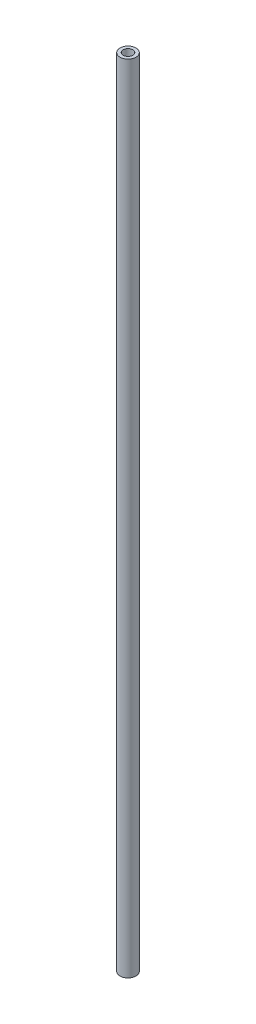
ISO-10303-21;
HEADER;
FILE_DESCRIPTION(('STEP AP214'),'2;1');
FILE_NAME('part.step','',(''),(''),'','','');
FILE_SCHEMA(('AUTOMOTIVE_DESIGN { 1 0 10303 214 1 1 1 1 }'));
ENDSEC;
DATA;
#1=APPLICATION_CONTEXT('core data for automotive mechanical design processes');
#2=APPLICATION_PROTOCOL_DEFINITION('international standard','automotive_design',2000,#1);
#3=PRODUCT_CONTEXT('',#1,'mechanical');
#4=PRODUCT('Part','Part','',(#3));
#5=PRODUCT_RELATED_PRODUCT_CATEGORY('part','',(#4));
#6=PRODUCT_DEFINITION_FORMATION('','',#4);
#7=PRODUCT_DEFINITION_CONTEXT('part definition',#1,'design');
#8=PRODUCT_DEFINITION('design','',#6,#7);
#9=PRODUCT_DEFINITION_SHAPE('','',#8);
#10=(LENGTH_UNIT() NAMED_UNIT(*) SI_UNIT(.MILLI.,.METRE.));
#11=(NAMED_UNIT(*) PLANE_ANGLE_UNIT() SI_UNIT($,.RADIAN.));
#12=(NAMED_UNIT(*) SI_UNIT($,.STERADIAN.) SOLID_ANGLE_UNIT());
#13=UNCERTAINTY_MEASURE_WITH_UNIT(LENGTH_MEASURE(1.E-05),#10,'distance_accuracy_value','');
#14=(GEOMETRIC_REPRESENTATION_CONTEXT(3) GLOBAL_UNCERTAINTY_ASSIGNED_CONTEXT((#13)) GLOBAL_UNIT_ASSIGNED_CONTEXT((#10,
#11,#12)) REPRESENTATION_CONTEXT('',''));
#15=CARTESIAN_POINT('',(0.,0.,0.));
#16=DIRECTION('',(0.,0.,1.));
#17=DIRECTION('',(1.,0.,0.));
#18=AXIS2_PLACEMENT_3D('',#15,#16,#17);
#19=CARTESIAN_POINT('',(0.,497.,0.));
#20=DIRECTION('',(0.,1.,0.));
#21=DIRECTION('',(0.,0.,1.));
#22=AXIS2_PLACEMENT_3D('',#19,#20,#21);
#23=PLANE('',#22);
#24=CARTESIAN_POINT('',(0.,497.,0.));
#25=DIRECTION('',(0.,1.,0.));
#26=DIRECTION('',(0.,0.,1.));
#27=AXIS2_PLACEMENT_3D('',#24,#25,#26);
#28=CIRCLE('',#27,5.);
#29=CARTESIAN_POINT('',(0.,497.,-5.));
#30=VERTEX_POINT('',#29);
#31=EDGE_CURVE('E10',#30,#30,#28,.T.);
#32=ORIENTED_EDGE('',*,*,#31,.T.);
#33=EDGE_LOOP('',(#32));
#34=FACE_BOUND('',#33,.T.);
#35=CARTESIAN_POINT('',(0.,497.,0.));
#36=DIRECTION('',(0.,1.,0.));
#37=DIRECTION('',(0.,0.,1.));
#38=AXIS2_PLACEMENT_3D('',#35,#36,#37);
#39=CIRCLE('',#38,3.);
#40=CARTESIAN_POINT('',(0.,497.,-3.));
#41=VERTEX_POINT('',#40);
#42=EDGE_CURVE('E50',#41,#41,#39,.T.);
#43=ORIENTED_EDGE('',*,*,#42,.F.);
#44=EDGE_LOOP('',(#43));
#45=FACE_BOUND('',#44,.T.);
#46=ADVANCED_FACE('F37',(#34,#45),#23,.T.);
#47=CARTESIAN_POINT('',(0.,0.,0.));
#48=DIRECTION('',(0.,1.,0.));
#49=DIRECTION('',(0.,0.,1.));
#50=AXIS2_PLACEMENT_3D('',#47,#48,#49);
#51=PLANE('',#50);
#52=CARTESIAN_POINT('',(0.,0.,0.));
#53=DIRECTION('',(0.,1.,0.));
#54=DIRECTION('',(0.,0.,1.));
#55=AXIS2_PLACEMENT_3D('',#52,#53,#54);
#56=CIRCLE('',#55,5.);
#57=CARTESIAN_POINT('',(0.,0.,-5.));
#58=VERTEX_POINT('',#57);
#59=EDGE_CURVE('E41',#58,#58,#56,.T.);
#60=ORIENTED_EDGE('',*,*,#59,.F.);
#61=EDGE_LOOP('',(#60));
#62=FACE_BOUND('',#61,.T.);
#63=CARTESIAN_POINT('',(0.,0.,0.));
#64=DIRECTION('',(0.,1.,0.));
#65=DIRECTION('',(0.,0.,1.));
#66=AXIS2_PLACEMENT_3D('',#63,#64,#65);
#67=CIRCLE('',#66,3.);
#68=CARTESIAN_POINT('',(0.,0.,-3.));
#69=VERTEX_POINT('',#68);
#70=EDGE_CURVE('E52',#69,#69,#67,.T.);
#71=ORIENTED_EDGE('',*,*,#70,.T.);
#72=EDGE_LOOP('',(#71));
#73=FACE_BOUND('',#72,.T.);
#74=ADVANCED_FACE('F64',(#62,#73),#51,.F.);
#75=CARTESIAN_POINT('',(0.,497.,0.));
#76=DIRECTION('',(0.,-1.,0.));
#77=DIRECTION('',(0.,0.,-1.));
#78=AXIS2_PLACEMENT_3D('',#75,#76,#77);
#79=CYLINDRICAL_SURFACE('',#78,5.);
#80=CARTESIAN_POINT('',(0.,497.,-5.));
#81=CARTESIAN_POINT('',(0.,491.822916666667,-5.));
#82=CARTESIAN_POINT('',(0.,486.645833333333,-5.));
#83=CARTESIAN_POINT('',(0.,476.291666666667,-5.));
#84=CARTESIAN_POINT('',(0.,471.114583333333,-5.));
#85=CARTESIAN_POINT('',(0.,460.760416666667,-5.));
#86=CARTESIAN_POINT('',(0.,455.583333333333,-5.));
#87=CARTESIAN_POINT('',(0.,445.229166666667,-5.));
#88=CARTESIAN_POINT('',(0.,440.052083333333,-5.));
#89=CARTESIAN_POINT('',(0.,429.697916666667,-5.));
#90=CARTESIAN_POINT('',(0.,424.520833333333,-5.));
#91=CARTESIAN_POINT('',(0.,414.166666666667,-5.));
#92=CARTESIAN_POINT('',(0.,408.989583333333,-5.));
#93=CARTESIAN_POINT('',(0.,398.635416666667,-5.));
#94=CARTESIAN_POINT('',(0.,393.458333333333,-5.));
#95=CARTESIAN_POINT('',(0.,383.104166666667,-5.));
#96=CARTESIAN_POINT('',(0.,377.927083333333,-5.));
#97=CARTESIAN_POINT('',(0.,367.572916666667,-5.));
#98=CARTESIAN_POINT('',(0.,362.395833333333,-5.));
#99=CARTESIAN_POINT('',(0.,352.041666666667,-5.));
#100=CARTESIAN_POINT('',(0.,346.864583333333,-5.));
#101=CARTESIAN_POINT('',(0.,336.510416666667,-5.));
#102=CARTESIAN_POINT('',(0.,331.333333333333,-5.));
#103=CARTESIAN_POINT('',(0.,320.979166666667,-5.));
#104=CARTESIAN_POINT('',(0.,315.802083333333,-5.));
#105=CARTESIAN_POINT('',(0.,305.447916666667,-5.));
#106=CARTESIAN_POINT('',(0.,300.270833333333,-5.));
#107=CARTESIAN_POINT('',(0.,289.916666666667,-5.));
#108=CARTESIAN_POINT('',(0.,284.739583333333,-5.));
#109=CARTESIAN_POINT('',(0.,274.385416666667,-5.));
#110=CARTESIAN_POINT('',(0.,269.208333333333,-5.));
#111=CARTESIAN_POINT('',(0.,258.854166666667,-5.));
#112=CARTESIAN_POINT('',(0.,253.677083333333,-5.));
#113=CARTESIAN_POINT('',(0.,243.322916666667,-5.));
#114=CARTESIAN_POINT('',(0.,238.145833333333,-5.));
#115=CARTESIAN_POINT('',(0.,227.791666666667,-5.));
#116=CARTESIAN_POINT('',(0.,222.614583333333,-5.));
#117=CARTESIAN_POINT('',(0.,212.260416666667,-5.));
#118=CARTESIAN_POINT('',(0.,207.083333333333,-5.));
#119=CARTESIAN_POINT('',(0.,196.729166666667,-5.));
#120=CARTESIAN_POINT('',(0.,191.552083333333,-5.));
#121=CARTESIAN_POINT('',(0.,181.197916666667,-5.));
#122=CARTESIAN_POINT('',(0.,176.020833333333,-5.));
#123=CARTESIAN_POINT('',(0.,165.666666666667,-5.));
#124=CARTESIAN_POINT('',(0.,160.489583333333,-5.));
#125=CARTESIAN_POINT('',(0.,150.135416666667,-5.));
#126=CARTESIAN_POINT('',(0.,144.958333333333,-5.));
#127=CARTESIAN_POINT('',(0.,134.604166666667,-5.));
#128=CARTESIAN_POINT('',(0.,129.427083333333,-5.));
#129=CARTESIAN_POINT('',(0.,119.072916666667,-5.));
#130=CARTESIAN_POINT('',(0.,113.895833333333,-5.));
#131=CARTESIAN_POINT('',(0.,103.541666666667,-5.));
#132=CARTESIAN_POINT('',(0.,98.3645833333333,-5.));
#133=CARTESIAN_POINT('',(0.,88.0104166666666,-5.));
#134=CARTESIAN_POINT('',(0.,82.8333333333333,-5.));
#135=CARTESIAN_POINT('',(0.,72.4791666666666,-5.));
#136=CARTESIAN_POINT('',(0.,67.3020833333333,-5.));
#137=CARTESIAN_POINT('',(0.,56.9479166666666,-5.));
#138=CARTESIAN_POINT('',(0.,51.7708333333333,-5.));
#139=CARTESIAN_POINT('',(0.,41.4166666666666,-5.));
#140=CARTESIAN_POINT('',(0.,36.2395833333333,-5.));
#141=CARTESIAN_POINT('',(0.,25.8854166666666,-5.));
#142=CARTESIAN_POINT('',(0.,20.7083333333333,-5.));
#143=CARTESIAN_POINT('',(0.,10.3541666666666,-5.));
#144=CARTESIAN_POINT('',(0.,5.17708333333327,-5.));
#145=CARTESIAN_POINT('',(0.,0.,-5.));
#146=B_SPLINE_CURVE_WITH_KNOTS('',3,(#80,#81,#82,#83,#84,#85,#86,#87,#88,#89,#90,#91,#92,#93,
#94,#95,#96,#97,#98,#99,#100,#101,#102,#103,#104,#105,#106,#107,#108,#109,#110,#111,#112,#113,
#114,#115,#116,#117,#118,#119,#120,#121,#122,#123,#124,#125,#126,#127,#128,#129,#130,#131,#132,
#133,#134,#135,#136,#137,#138,#139,#140,#141,#142,#143,#144,#145),.UNSPECIFIED.,.F.,.F.,(4,2,2,
2,2,2,2,2,2,2,2,2,2,2,2,2,2,2,2,2,2,2,2,2,2,2,2,2,2,2,2,2,4),(0.,15.53125,31.0625,46.59375,
62.125,77.65625,93.1875,108.71875,124.25,139.78125,155.3125,170.84375,186.375,201.90625,
217.4375,232.96875,248.5,264.03125,279.5625,295.09375,310.625,326.15625,341.6875,357.21875,
372.75,388.28125,403.8125,419.34375,434.875,450.40625,465.9375,481.46875,497.),.UNSPECIFIED.);
#147=EDGE_CURVE('BSEAM39',#30,#58,#146,.T.);
#148=ORIENTED_EDGE('',*,*,#31,.F.);
#149=ORIENTED_EDGE('',*,*,#59,.T.);
#150=ORIENTED_EDGE('',*,*,#147,.T.);
#151=ORIENTED_EDGE('',*,*,#147,.F.);
#152=EDGE_LOOP('',(#148,#150,#149,#151));
#153=FACE_BOUND('',#152,.T.);
#154=ADVANCED_FACE('F39',(#153),#79,.T.);
#155=CARTESIAN_POINT('',(0.,497.,0.));
#156=DIRECTION('',(0.,-1.,0.));
#157=DIRECTION('',(0.,0.,-1.));
#158=AXIS2_PLACEMENT_3D('',#155,#156,#157);
#159=CYLINDRICAL_SURFACE('',#158,3.);
#160=CARTESIAN_POINT('',(0.,497.,-3.));
#161=CARTESIAN_POINT('',(0.,491.822916666667,-3.));
#162=CARTESIAN_POINT('',(0.,486.645833333333,-3.));
#163=CARTESIAN_POINT('',(0.,476.291666666667,-3.));
#164=CARTESIAN_POINT('',(0.,471.114583333333,-3.));
#165=CARTESIAN_POINT('',(0.,460.760416666667,-3.));
#166=CARTESIAN_POINT('',(0.,455.583333333333,-3.));
#167=CARTESIAN_POINT('',(0.,445.229166666667,-3.));
#168=CARTESIAN_POINT('',(0.,440.052083333333,-3.));
#169=CARTESIAN_POINT('',(0.,429.697916666667,-3.));
#170=CARTESIAN_POINT('',(0.,424.520833333333,-3.));
#171=CARTESIAN_POINT('',(0.,414.166666666667,-3.));
#172=CARTESIAN_POINT('',(0.,408.989583333333,-3.));
#173=CARTESIAN_POINT('',(0.,398.635416666667,-3.));
#174=CARTESIAN_POINT('',(0.,393.458333333333,-3.));
#175=CARTESIAN_POINT('',(0.,383.104166666667,-3.));
#176=CARTESIAN_POINT('',(0.,377.927083333333,-3.));
#177=CARTESIAN_POINT('',(0.,367.572916666667,-3.));
#178=CARTESIAN_POINT('',(0.,362.395833333333,-3.));
#179=CARTESIAN_POINT('',(0.,352.041666666667,-3.));
#180=CARTESIAN_POINT('',(0.,346.864583333333,-3.));
#181=CARTESIAN_POINT('',(0.,336.510416666667,-3.));
#182=CARTESIAN_POINT('',(0.,331.333333333333,-3.));
#183=CARTESIAN_POINT('',(0.,320.979166666667,-3.));
#184=CARTESIAN_POINT('',(0.,315.802083333333,-3.));
#185=CARTESIAN_POINT('',(0.,305.447916666667,-3.));
#186=CARTESIAN_POINT('',(0.,300.270833333333,-3.));
#187=CARTESIAN_POINT('',(0.,289.916666666667,-3.));
#188=CARTESIAN_POINT('',(0.,284.739583333333,-3.));
#189=CARTESIAN_POINT('',(0.,274.385416666667,-3.));
#190=CARTESIAN_POINT('',(0.,269.208333333333,-3.));
#191=CARTESIAN_POINT('',(0.,258.854166666667,-3.));
#192=CARTESIAN_POINT('',(0.,253.677083333333,-3.));
#193=CARTESIAN_POINT('',(0.,243.322916666667,-3.));
#194=CARTESIAN_POINT('',(0.,238.145833333333,-3.));
#195=CARTESIAN_POINT('',(0.,227.791666666667,-3.));
#196=CARTESIAN_POINT('',(0.,222.614583333333,-3.));
#197=CARTESIAN_POINT('',(0.,212.260416666667,-3.));
#198=CARTESIAN_POINT('',(0.,207.083333333333,-3.));
#199=CARTESIAN_POINT('',(0.,196.729166666667,-3.));
#200=CARTESIAN_POINT('',(0.,191.552083333333,-3.));
#201=CARTESIAN_POINT('',(0.,181.197916666667,-3.));
#202=CARTESIAN_POINT('',(0.,176.020833333333,-3.));
#203=CARTESIAN_POINT('',(0.,165.666666666667,-3.));
#204=CARTESIAN_POINT('',(0.,160.489583333333,-3.));
#205=CARTESIAN_POINT('',(0.,150.135416666667,-3.));
#206=CARTESIAN_POINT('',(0.,144.958333333333,-3.));
#207=CARTESIAN_POINT('',(0.,134.604166666667,-3.));
#208=CARTESIAN_POINT('',(0.,129.427083333333,-3.));
#209=CARTESIAN_POINT('',(0.,119.072916666667,-3.));
#210=CARTESIAN_POINT('',(0.,113.895833333333,-3.));
#211=CARTESIAN_POINT('',(0.,103.541666666667,-3.));
#212=CARTESIAN_POINT('',(0.,98.3645833333333,-3.));
#213=CARTESIAN_POINT('',(0.,88.0104166666666,-3.));
#214=CARTESIAN_POINT('',(0.,82.8333333333333,-3.));
#215=CARTESIAN_POINT('',(0.,72.4791666666666,-3.));
#216=CARTESIAN_POINT('',(0.,67.3020833333333,-3.));
#217=CARTESIAN_POINT('',(0.,56.9479166666666,-3.));
#218=CARTESIAN_POINT('',(0.,51.7708333333333,-3.));
#219=CARTESIAN_POINT('',(0.,41.4166666666666,-3.));
#220=CARTESIAN_POINT('',(0.,36.2395833333333,-3.));
#221=CARTESIAN_POINT('',(0.,25.8854166666666,-3.));
#222=CARTESIAN_POINT('',(0.,20.7083333333333,-3.));
#223=CARTESIAN_POINT('',(0.,10.3541666666666,-3.));
#224=CARTESIAN_POINT('',(0.,5.17708333333327,-3.));
#225=CARTESIAN_POINT('',(0.,0.,-3.));
#226=B_SPLINE_CURVE_WITH_KNOTS('',3,(#160,#161,#162,#163,#164,#165,#166,#167,#168,#169,#170,
#171,#172,#173,#174,#175,#176,#177,#178,#179,#180,#181,#182,#183,#184,#185,#186,#187,#188,#189,
#190,#191,#192,#193,#194,#195,#196,#197,#198,#199,#200,#201,#202,#203,#204,#205,#206,#207,#208,
#209,#210,#211,#212,#213,#214,#215,#216,#217,#218,#219,#220,#221,#222,#223,#224,#225),
.UNSPECIFIED.,.F.,.F.,(4,2,2,2,2,2,2,2,2,2,2,2,2,2,2,2,2,2,2,2,2,2,2,2,2,2,2,2,2,2,2,2,4),(0.,
15.53125,31.0625,46.59375,62.125,77.65625,93.1875,108.71875,124.25,139.78125,155.3125,170.84375,
186.375,201.90625,217.4375,232.96875,248.5,264.03125,279.5625,295.09375,310.625,326.15625,
341.6875,357.21875,372.75,388.28125,403.8125,419.34375,434.875,450.40625,465.9375,481.46875,
497.),.UNSPECIFIED.);
#227=EDGE_CURVE('BSEAM60',#41,#69,#226,.T.);
#228=ORIENTED_EDGE('',*,*,#42,.T.);
#229=ORIENTED_EDGE('',*,*,#70,.F.);
#230=ORIENTED_EDGE('',*,*,#227,.T.);
#231=ORIENTED_EDGE('',*,*,#227,.F.);
#232=EDGE_LOOP('',(#228,#230,#229,#231));
#233=FACE_BOUND('',#232,.T.);
#234=ADVANCED_FACE('F60',(#233),#159,.F.);
#235=CLOSED_SHELL('',(#46,#74,#154,#234));
#236=MANIFOLD_SOLID_BREP('B2',#235);
#237=ADVANCED_BREP_SHAPE_REPRESENTATION('',(#18,#236),#14);
#238=SHAPE_DEFINITION_REPRESENTATION(#9,#237);
ENDSEC;
END-ISO-10303-21;
